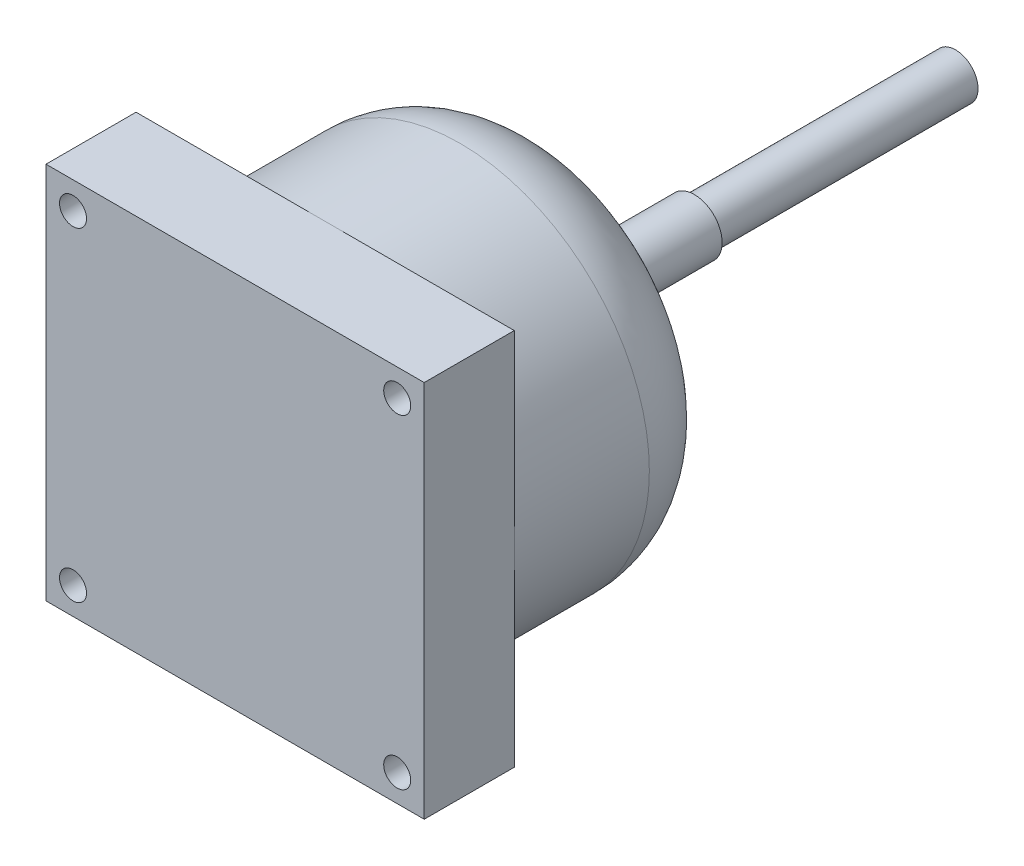
ISO-10303-21;
HEADER;
FILE_DESCRIPTION(('STEP AP214'),'2;1');
FILE_NAME('part.step','',(''),(''),'','','');
FILE_SCHEMA(('AUTOMOTIVE_DESIGN { 1 0 10303 214 1 1 1 1 }'));
ENDSEC;
DATA;
#1=APPLICATION_CONTEXT('core data for automotive mechanical design processes');
#2=APPLICATION_PROTOCOL_DEFINITION('international standard','automotive_design',2000,#1);
#3=PRODUCT_CONTEXT('',#1,'mechanical');
#4=PRODUCT('Part','Part','',(#3));
#5=PRODUCT_RELATED_PRODUCT_CATEGORY('part','',(#4));
#6=PRODUCT_DEFINITION_FORMATION('','',#4);
#7=PRODUCT_DEFINITION_CONTEXT('part definition',#1,'design');
#8=PRODUCT_DEFINITION('design','',#6,#7);
#9=PRODUCT_DEFINITION_SHAPE('','',#8);
#10=(LENGTH_UNIT() NAMED_UNIT(*) SI_UNIT(.MILLI.,.METRE.));
#11=(NAMED_UNIT(*) PLANE_ANGLE_UNIT() SI_UNIT($,.RADIAN.));
#12=(NAMED_UNIT(*) SI_UNIT($,.STERADIAN.) SOLID_ANGLE_UNIT());
#13=UNCERTAINTY_MEASURE_WITH_UNIT(LENGTH_MEASURE(1.E-05),#10,'distance_accuracy_value','');
#14=(GEOMETRIC_REPRESENTATION_CONTEXT(3) GLOBAL_UNCERTAINTY_ASSIGNED_CONTEXT((#13)) GLOBAL_UNIT_ASSIGNED_CONTEXT((#10,
#11,#12)) REPRESENTATION_CONTEXT('',''));
#15=CARTESIAN_POINT('',(0.,0.,0.));
#16=DIRECTION('',(0.,0.,1.));
#17=DIRECTION('',(1.,0.,0.));
#18=AXIS2_PLACEMENT_3D('',#15,#16,#17);
#19=CARTESIAN_POINT('',(-33.2954156821291,25.452495543672,46.));
#20=DIRECTION('',(0.,0.,-1.));
#21=DIRECTION('',(-1.,0.,0.));
#22=AXIS2_PLACEMENT_3D('',#19,#20,#21);
#23=CYLINDRICAL_SURFACE('',#22,21.);
#24=CARTESIAN_POINT('',(-33.2954156821291,25.452495543672,10.));
#25=DIRECTION('',(0.,0.,1.));
#26=DIRECTION('',(1.,0.,0.));
#27=AXIS2_PLACEMENT_3D('',#24,#25,#26);
#28=CIRCLE('',#27,21.);
#29=CARTESIAN_POINT('',(-12.2954156821291,25.452495543672,10.));
#30=VERTEX_POINT('',#29);
#31=EDGE_CURVE('E134',#30,#30,#28,.T.);
#32=ORIENTED_EDGE('',*,*,#31,.T.);
#33=EDGE_LOOP('',(#32));
#34=FACE_BOUND('',#33,.T.);
#35=CARTESIAN_POINT('',(-33.2954156821291,25.452495543672,25.));
#36=DIRECTION('',(0.,0.,-1.));
#37=DIRECTION('',(-1.,0.,0.));
#38=AXIS2_PLACEMENT_3D('',#35,#36,#37);
#39=CIRCLE('',#38,21.);
#40=CARTESIAN_POINT('',(-54.2954156821291,25.452495543672,25.));
#41=VERTEX_POINT('',#40);
#42=CARTESIAN_POINT('',(-33.2954156821291,46.452495543672,25.));
#43=VERTEX_POINT('',#42);
#44=EDGE_CURVE('E124',#41,#43,#39,.T.);
#45=ORIENTED_EDGE('',*,*,#44,.T.);
#46=CARTESIAN_POINT('',(-33.2954156821291,25.452495543672,25.));
#47=DIRECTION('',(0.,0.,-1.));
#48=DIRECTION('',(-1.,0.,0.));
#49=AXIS2_PLACEMENT_3D('',#46,#47,#48);
#50=CIRCLE('',#49,21.);
#51=CARTESIAN_POINT('',(-12.2954156821291,25.452495543672,25.));
#52=VERTEX_POINT('',#51);
#53=EDGE_CURVE('E111',#43,#52,#50,.T.);
#54=ORIENTED_EDGE('',*,*,#53,.T.);
#55=CARTESIAN_POINT('',(-33.2954156821291,25.452495543672,25.));
#56=DIRECTION('',(0.,0.,-1.));
#57=DIRECTION('',(-1.,0.,0.));
#58=AXIS2_PLACEMENT_3D('',#55,#56,#57);
#59=CIRCLE('',#58,21.);
#60=CARTESIAN_POINT('',(-33.2954156821291,4.45249554367201,25.));
#61=VERTEX_POINT('',#60);
#62=EDGE_CURVE('E300',#52,#61,#59,.T.);
#63=ORIENTED_EDGE('',*,*,#62,.T.);
#64=CARTESIAN_POINT('',(-33.2954156821291,25.452495543672,25.));
#65=DIRECTION('',(0.,0.,-1.));
#66=DIRECTION('',(-1.,0.,0.));
#67=AXIS2_PLACEMENT_3D('',#64,#65,#66);
#68=CIRCLE('',#67,21.);
#69=EDGE_CURVE('E132',#61,#41,#68,.T.);
#70=ORIENTED_EDGE('',*,*,#69,.T.);
#71=EDGE_LOOP('',(#45,#54,#63,#70));
#72=FACE_BOUND('',#71,.T.);
#73=ADVANCED_FACE('F47',(#34,#72),#23,.T.);
#74=CARTESIAN_POINT('',(-33.2954156821291,25.452495543672,0.));
#75=DIRECTION('',(0.,0.,1.));
#76=DIRECTION('',(1.,0.,0.));
#77=AXIS2_PLACEMENT_3D('',#74,#75,#76);
#78=PLANE('',#77);
#79=CARTESIAN_POINT('',(-33.2954156821291,25.452495543672,0.));
#80=DIRECTION('',(0.,0.,1.));
#81=DIRECTION('',(1.,0.,0.));
#82=AXIS2_PLACEMENT_3D('',#79,#80,#81);
#83=CIRCLE('',#82,3.07937286828549);
#84=CARTESIAN_POINT('',(-30.2160428138436,25.452495543672,0.));
#85=VERTEX_POINT('',#84);
#86=EDGE_CURVE('E145',#85,#85,#83,.F.);
#87=ORIENTED_EDGE('',*,*,#86,.F.);
#88=EDGE_LOOP('',(#87));
#89=FACE_BOUND('',#88,.T.);
#90=CARTESIAN_POINT('',(-33.2954156821291,25.452495543672,0.));
#91=DIRECTION('',(0.,0.,1.));
#92=DIRECTION('',(1.,0.,0.));
#93=AXIS2_PLACEMENT_3D('',#90,#91,#92);
#94=CIRCLE('',#93,11.);
#95=CARTESIAN_POINT('',(-22.2954156821291,25.452495543672,0.));
#96=VERTEX_POINT('',#95);
#97=EDGE_CURVE('E140',#96,#96,#94,.F.);
#98=ORIENTED_EDGE('',*,*,#97,.T.);
#99=EDGE_LOOP('',(#98));
#100=FACE_BOUND('',#99,.T.);
#101=ADVANCED_FACE('F174',(#89,#100),#78,.F.);
#102=CARTESIAN_POINT('',(-33.2954156821291,25.452495543672,10.));
#103=DIRECTION('',(0.,0.,1.));
#104=DIRECTION('',(1.,0.,0.));
#105=AXIS2_PLACEMENT_3D('',#102,#103,#104);
#106=TOROIDAL_SURFACE('',#105,11.,10.);
#107=ORIENTED_EDGE('',*,*,#97,.F.);
#108=EDGE_LOOP('',(#107));
#109=FACE_BOUND('',#108,.T.);
#110=ORIENTED_EDGE('',*,*,#31,.F.);
#111=EDGE_LOOP('',(#110));
#112=FACE_BOUND('',#111,.T.);
#113=ADVANCED_FACE('F170',(#109,#112),#106,.T.);
#114=CARTESIAN_POINT('',(-33.2954156821291,25.452495543672,-16.));
#115=DIRECTION('',(0.,0.,1.));
#116=DIRECTION('',(1.,0.,0.));
#117=AXIS2_PLACEMENT_3D('',#114,#115,#116);
#118=CYLINDRICAL_SURFACE('',#117,3.07937286828549);
#119=CARTESIAN_POINT('',(-33.2954156821291,25.452495543672,-16.));
#120=DIRECTION('',(0.,0.,-1.));
#121=DIRECTION('',(-1.,0.,0.));
#122=AXIS2_PLACEMENT_3D('',#119,#120,#121);
#123=CIRCLE('',#122,3.07937286828549);
#124=CARTESIAN_POINT('',(-36.3747885504146,25.452495543672,-16.));
#125=VERTEX_POINT('',#124);
#126=EDGE_CURVE('E149',#125,#125,#123,.T.);
#127=ORIENTED_EDGE('',*,*,#126,.F.);
#128=EDGE_LOOP('',(#127));
#129=FACE_BOUND('',#128,.T.);
#130=ORIENTED_EDGE('',*,*,#86,.T.);
#131=EDGE_LOOP('',(#130));
#132=FACE_BOUND('',#131,.T.);
#133=ADVANCED_FACE('F164',(#129,#132),#118,.T.);
#134=CARTESIAN_POINT('',(-33.2954156821291,25.452495543672,-16.));
#135=DIRECTION('',(0.,0.,-1.));
#136=DIRECTION('',(-1.,0.,0.));
#137=AXIS2_PLACEMENT_3D('',#134,#135,#136);
#138=PLANE('',#137);
#139=CARTESIAN_POINT('',(-33.2954156821291,25.452495543672,-16.));
#140=DIRECTION('',(0.,0.,-1.));
#141=DIRECTION('',(-1.,0.,0.));
#142=AXIS2_PLACEMENT_3D('',#139,#140,#141);
#143=CIRCLE('',#142,2.5);
#144=CARTESIAN_POINT('',(-35.7954156821291,25.452495543672,-16.));
#145=VERTEX_POINT('',#144);
#146=EDGE_CURVE('E57',#145,#145,#143,.T.);
#147=ORIENTED_EDGE('',*,*,#146,.F.);
#148=EDGE_LOOP('',(#147));
#149=FACE_BOUND('',#148,.T.);
#150=ORIENTED_EDGE('',*,*,#126,.T.);
#151=EDGE_LOOP('',(#150));
#152=FACE_BOUND('',#151,.T.);
#153=ADVANCED_FACE('F161',(#149,#152),#138,.T.);
#154=CARTESIAN_POINT('',(-33.2954156821291,25.452495543672,-45.));
#155=DIRECTION('',(0.,0.,1.));
#156=DIRECTION('',(1.,0.,0.));
#157=AXIS2_PLACEMENT_3D('',#154,#155,#156);
#158=CYLINDRICAL_SURFACE('',#157,2.5);
#159=CARTESIAN_POINT('',(-33.2954156821291,25.452495543672,-45.));
#160=DIRECTION('',(0.,0.,-1.));
#161=DIRECTION('',(-1.,0.,0.));
#162=AXIS2_PLACEMENT_3D('',#159,#160,#161);
#163=CIRCLE('',#162,2.5);
#164=CARTESIAN_POINT('',(-35.7954156821291,25.452495543672,-45.));
#165=VERTEX_POINT('',#164);
#166=EDGE_CURVE('E11',#165,#165,#163,.T.);
#167=ORIENTED_EDGE('',*,*,#166,.F.);
#168=EDGE_LOOP('',(#167));
#169=FACE_BOUND('',#168,.T.);
#170=ORIENTED_EDGE('',*,*,#146,.T.);
#171=EDGE_LOOP('',(#170));
#172=FACE_BOUND('',#171,.T.);
#173=ADVANCED_FACE('F159',(#169,#172),#158,.T.);
#174=CARTESIAN_POINT('',(-33.2954156821291,25.452495543672,-45.));
#175=DIRECTION('',(0.,0.,-1.));
#176=DIRECTION('',(-1.,0.,0.));
#177=AXIS2_PLACEMENT_3D('',#174,#175,#176);
#178=PLANE('',#177);
#179=ORIENTED_EDGE('',*,*,#166,.T.);
#180=EDGE_LOOP('',(#179));
#181=FACE_BOUND('',#180,.T.);
#182=ADVANCED_FACE('F49',(#181),#178,.T.);
#183=CARTESIAN_POINT('',(-33.2954156821291,25.452495543672,35.));
#184=DIRECTION('',(0.,0.,1.));
#185=DIRECTION('',(1.,0.,0.));
#186=AXIS2_PLACEMENT_3D('',#183,#184,#185);
#187=PLANE('',#186);
#188=CARTESIAN_POINT('',(-15.2954156821291,7.45249554367201,35.));
#189=DIRECTION('',(0.,0.,-1.));
#190=DIRECTION('',(-1.,0.,0.));
#191=AXIS2_PLACEMENT_3D('',#188,#189,#190);
#192=CIRCLE('',#191,1.5);
#193=CARTESIAN_POINT('',(-16.7954156821291,7.45249554367201,35.));
#194=VERTEX_POINT('',#193);
#195=EDGE_CURVE('E280',#194,#194,#192,.T.);
#196=ORIENTED_EDGE('',*,*,#195,.T.);
#197=EDGE_LOOP('',(#196));
#198=FACE_BOUND('',#197,.T.);
#199=CARTESIAN_POINT('',(-51.2954156821291,7.45249554367201,35.));
#200=DIRECTION('',(0.,0.,-1.));
#201=DIRECTION('',(-1.,0.,0.));
#202=AXIS2_PLACEMENT_3D('',#199,#200,#201);
#203=CIRCLE('',#202,1.5);
#204=CARTESIAN_POINT('',(-52.7954156821291,7.45249554367201,35.));
#205=VERTEX_POINT('',#204);
#206=EDGE_CURVE('E272',#205,#205,#203,.T.);
#207=ORIENTED_EDGE('',*,*,#206,.T.);
#208=EDGE_LOOP('',(#207));
#209=FACE_BOUND('',#208,.T.);
#210=CARTESIAN_POINT('',(-51.2954156821291,43.452495543672,35.));
#211=DIRECTION('',(0.,0.,-1.));
#212=DIRECTION('',(-1.,0.,0.));
#213=AXIS2_PLACEMENT_3D('',#210,#211,#212);
#214=CIRCLE('',#213,1.5);
#215=CARTESIAN_POINT('',(-52.7954156821291,43.452495543672,35.));
#216=VERTEX_POINT('',#215);
#217=EDGE_CURVE('E255',#216,#216,#214,.T.);
#218=ORIENTED_EDGE('',*,*,#217,.T.);
#219=EDGE_LOOP('',(#218));
#220=FACE_BOUND('',#219,.T.);
#221=CARTESIAN_POINT('',(-15.2954156821291,43.452495543672,35.));
#222=DIRECTION('',(0.,0.,-1.));
#223=DIRECTION('',(-1.,0.,0.));
#224=AXIS2_PLACEMENT_3D('',#221,#222,#223);
#225=CIRCLE('',#224,1.5);
#226=CARTESIAN_POINT('',(-16.7954156821291,43.452495543672,35.));
#227=VERTEX_POINT('',#226);
#228=EDGE_CURVE('E108',#227,#227,#225,.T.);
#229=ORIENTED_EDGE('',*,*,#228,.T.);
#230=EDGE_LOOP('',(#229));
#231=FACE_BOUND('',#230,.T.);
#232=DIRECTION('',(0.,-1.,0.));
#233=VECTOR('',#232,1.);
#234=CARTESIAN_POINT('',(-54.2954156821291,4.45249554367201,35.));
#235=LINE('',#234,#233);
#236=CARTESIAN_POINT('',(-54.2954156821291,46.452495543672,35.));
#237=VERTEX_POINT('',#236);
#238=CARTESIAN_POINT('',(-54.2954156821291,4.45249554367201,35.));
#239=VERTEX_POINT('',#238);
#240=EDGE_CURVE('E142',#237,#239,#235,.T.);
#241=ORIENTED_EDGE('',*,*,#240,.T.);
#242=DIRECTION('',(1.,0.,0.));
#243=VECTOR('',#242,1.);
#244=CARTESIAN_POINT('',(-12.2954156821291,4.45249554367201,35.));
#245=LINE('',#244,#243);
#246=CARTESIAN_POINT('',(-12.2954156821291,4.45249554367201,35.));
#247=VERTEX_POINT('',#246);
#248=EDGE_CURVE('E303',#239,#247,#245,.T.);
#249=ORIENTED_EDGE('',*,*,#248,.T.);
#250=DIRECTION('',(0.,1.,0.));
#251=VECTOR('',#250,1.);
#252=CARTESIAN_POINT('',(-12.2954156821291,46.452495543672,35.));
#253=LINE('',#252,#251);
#254=CARTESIAN_POINT('',(-12.2954156821291,46.452495543672,35.));
#255=VERTEX_POINT('',#254);
#256=EDGE_CURVE('E119',#247,#255,#253,.T.);
#257=ORIENTED_EDGE('',*,*,#256,.T.);
#258=DIRECTION('',(-1.,0.,0.));
#259=VECTOR('',#258,1.);
#260=CARTESIAN_POINT('',(-54.2954156821291,46.452495543672,35.));
#261=LINE('',#260,#259);
#262=EDGE_CURVE('E63',#255,#237,#261,.T.);
#263=ORIENTED_EDGE('',*,*,#262,.T.);
#264=EDGE_LOOP('',(#241,#249,#257,#263));
#265=FACE_BOUND('',#264,.T.);
#266=ADVANCED_FACE('F196',(#198,#209,#220,#231,#265),#187,.T.);
#267=CARTESIAN_POINT('',(0.,0.,25.));
#268=DIRECTION('',(0.,0.,-1.));
#269=DIRECTION('',(-1.,0.,0.));
#270=AXIS2_PLACEMENT_3D('',#267,#268,#269);
#271=PLANE('',#270);
#272=CARTESIAN_POINT('',(-51.2954156821291,43.452495543672,25.));
#273=DIRECTION('',(0.,0.,-1.));
#274=DIRECTION('',(-1.,0.,0.));
#275=AXIS2_PLACEMENT_3D('',#272,#273,#274);
#276=CIRCLE('',#275,1.5);
#277=CARTESIAN_POINT('',(-52.7954156821291,43.452495543672,25.));
#278=VERTEX_POINT('',#277);
#279=EDGE_CURVE('E258',#278,#278,#276,.T.);
#280=ORIENTED_EDGE('',*,*,#279,.F.);
#281=EDGE_LOOP('',(#280));
#282=FACE_BOUND('',#281,.T.);
#283=ORIENTED_EDGE('',*,*,#44,.F.);
#284=DIRECTION('',(0.,-1.,0.));
#285=VECTOR('',#284,1.);
#286=CARTESIAN_POINT('',(-54.2954156821291,4.45249554367201,25.));
#287=LINE('',#286,#285);
#288=CARTESIAN_POINT('',(-54.2954156821291,46.452495543672,25.));
#289=VERTEX_POINT('',#288);
#290=EDGE_CURVE('E126',#289,#41,#287,.T.);
#291=ORIENTED_EDGE('',*,*,#290,.F.);
#292=DIRECTION('',(-1.,0.,0.));
#293=VECTOR('',#292,1.);
#294=CARTESIAN_POINT('',(-33.2954156821291,46.452495543672,25.));
#295=LINE('',#294,#293);
#296=EDGE_CURVE('E102',#43,#289,#295,.T.);
#297=ORIENTED_EDGE('',*,*,#296,.F.);
#298=EDGE_LOOP('',(#283,#291,#297));
#299=FACE_BOUND('',#298,.T.);
#300=ADVANCED_FACE('F123',(#282,#299),#271,.T.);
#301=CARTESIAN_POINT('',(-33.2954156821291,46.452495543672,35.));
#302=DIRECTION('',(0.,-1.,0.));
#303=DIRECTION('',(0.,0.,-1.));
#304=AXIS2_PLACEMENT_3D('',#301,#302,#303);
#305=PLANE('',#304);
#306=ORIENTED_EDGE('',*,*,#262,.F.);
#307=DIRECTION('',(0.,0.,-1.));
#308=VECTOR('',#307,1.);
#309=CARTESIAN_POINT('',(-12.2954156821291,46.452495543672,35.));
#310=LINE('',#309,#308);
#311=CARTESIAN_POINT('',(-12.2954156821291,46.452495543672,25.));
#312=VERTEX_POINT('',#311);
#313=EDGE_CURVE('E105',#255,#312,#310,.T.);
#314=ORIENTED_EDGE('',*,*,#313,.T.);
#315=DIRECTION('',(-1.,0.,0.));
#316=VECTOR('',#315,1.);
#317=CARTESIAN_POINT('',(-33.2954156821291,46.452495543672,25.));
#318=LINE('',#317,#316);
#319=EDGE_CURVE('E97',#312,#43,#318,.T.);
#320=ORIENTED_EDGE('',*,*,#319,.T.);
#321=ORIENTED_EDGE('',*,*,#296,.T.);
#322=DIRECTION('',(0.,0.,-1.));
#323=VECTOR('',#322,1.);
#324=CARTESIAN_POINT('',(-54.2954156821291,46.452495543672,35.));
#325=LINE('',#324,#323);
#326=EDGE_CURVE('E135',#237,#289,#325,.T.);
#327=ORIENTED_EDGE('',*,*,#326,.F.);
#328=EDGE_LOOP('',(#306,#314,#320,#321,#327));
#329=FACE_BOUND('',#328,.T.);
#330=ADVANCED_FACE('F99',(#329),#305,.F.);
#331=CARTESIAN_POINT('',(-54.2954156821291,4.45249554367201,35.));
#332=DIRECTION('',(1.,0.,0.));
#333=DIRECTION('',(0.,0.,-1.));
#334=AXIS2_PLACEMENT_3D('',#331,#332,#333);
#335=PLANE('',#334);
#336=ORIENTED_EDGE('',*,*,#290,.T.);
#337=DIRECTION('',(0.,-1.,0.));
#338=VECTOR('',#337,1.);
#339=CARTESIAN_POINT('',(-54.2954156821291,4.45249554367201,25.));
#340=LINE('',#339,#338);
#341=CARTESIAN_POINT('',(-54.2954156821291,4.45249554367201,25.));
#342=VERTEX_POINT('',#341);
#343=EDGE_CURVE('E310',#41,#342,#340,.T.);
#344=ORIENTED_EDGE('',*,*,#343,.T.);
#345=DIRECTION('',(0.,0.,-1.));
#346=VECTOR('',#345,1.);
#347=CARTESIAN_POINT('',(-54.2954156821291,4.45249554367201,35.));
#348=LINE('',#347,#346);
#349=EDGE_CURVE('E306',#239,#342,#348,.T.);
#350=ORIENTED_EDGE('',*,*,#349,.F.);
#351=ORIENTED_EDGE('',*,*,#240,.F.);
#352=ORIENTED_EDGE('',*,*,#326,.T.);
#353=EDGE_LOOP('',(#336,#344,#350,#351,#352));
#354=FACE_BOUND('',#353,.T.);
#355=ADVANCED_FACE('F212',(#354),#335,.F.);
#356=CARTESIAN_POINT('',(0.,0.,25.));
#357=DIRECTION('',(0.,0.,-1.));
#358=DIRECTION('',(-1.,0.,0.));
#359=AXIS2_PLACEMENT_3D('',#356,#357,#358);
#360=PLANE('',#359);
#361=CARTESIAN_POINT('',(-51.2954156821291,7.45249554367201,25.));
#362=DIRECTION('',(0.,0.,-1.));
#363=DIRECTION('',(-1.,0.,0.));
#364=AXIS2_PLACEMENT_3D('',#361,#362,#363);
#365=CIRCLE('',#364,1.5);
#366=CARTESIAN_POINT('',(-52.7954156821291,7.45249554367201,25.));
#367=VERTEX_POINT('',#366);
#368=EDGE_CURVE('E266',#367,#367,#365,.T.);
#369=ORIENTED_EDGE('',*,*,#368,.F.);
#370=EDGE_LOOP('',(#369));
#371=FACE_BOUND('',#370,.T.);
#372=ORIENTED_EDGE('',*,*,#69,.F.);
#373=DIRECTION('',(1.,0.,0.));
#374=VECTOR('',#373,1.);
#375=CARTESIAN_POINT('',(-12.2954156821291,4.45249554367201,25.));
#376=LINE('',#375,#374);
#377=EDGE_CURVE('E311',#342,#61,#376,.T.);
#378=ORIENTED_EDGE('',*,*,#377,.F.);
#379=ORIENTED_EDGE('',*,*,#343,.F.);
#380=EDGE_LOOP('',(#372,#378,#379));
#381=FACE_BOUND('',#380,.T.);
#382=ADVANCED_FACE('F215',(#371,#381),#360,.T.);
#383=CARTESIAN_POINT('',(-12.2954156821291,4.45249554367201,35.));
#384=DIRECTION('',(0.,1.,0.));
#385=DIRECTION('',(0.,0.,1.));
#386=AXIS2_PLACEMENT_3D('',#383,#384,#385);
#387=PLANE('',#386);
#388=ORIENTED_EDGE('',*,*,#377,.T.);
#389=DIRECTION('',(1.,0.,0.));
#390=VECTOR('',#389,1.);
#391=CARTESIAN_POINT('',(-12.2954156821291,4.45249554367201,25.));
#392=LINE('',#391,#390);
#393=CARTESIAN_POINT('',(-12.2954156821291,4.45249554367201,25.));
#394=VERTEX_POINT('',#393);
#395=EDGE_CURVE('E294',#61,#394,#392,.T.);
#396=ORIENTED_EDGE('',*,*,#395,.T.);
#397=DIRECTION('',(0.,0.,-1.));
#398=VECTOR('',#397,1.);
#399=CARTESIAN_POINT('',(-12.2954156821291,4.45249554367201,35.));
#400=LINE('',#399,#398);
#401=EDGE_CURVE('E290',#247,#394,#400,.T.);
#402=ORIENTED_EDGE('',*,*,#401,.F.);
#403=ORIENTED_EDGE('',*,*,#248,.F.);
#404=ORIENTED_EDGE('',*,*,#349,.T.);
#405=EDGE_LOOP('',(#388,#396,#402,#403,#404));
#406=FACE_BOUND('',#405,.T.);
#407=ADVANCED_FACE('F218',(#406),#387,.F.);
#408=CARTESIAN_POINT('',(0.,0.,25.));
#409=DIRECTION('',(0.,0.,-1.));
#410=DIRECTION('',(-1.,0.,0.));
#411=AXIS2_PLACEMENT_3D('',#408,#409,#410);
#412=PLANE('',#411);
#413=CARTESIAN_POINT('',(-15.2954156821291,7.45249554367201,25.));
#414=DIRECTION('',(0.,0.,-1.));
#415=DIRECTION('',(-1.,0.,0.));
#416=AXIS2_PLACEMENT_3D('',#413,#414,#415);
#417=CIRCLE('',#416,1.5);
#418=CARTESIAN_POINT('',(-16.7954156821291,7.45249554367201,25.));
#419=VERTEX_POINT('',#418);
#420=EDGE_CURVE('E276',#419,#419,#417,.T.);
#421=ORIENTED_EDGE('',*,*,#420,.F.);
#422=EDGE_LOOP('',(#421));
#423=FACE_BOUND('',#422,.T.);
#424=ORIENTED_EDGE('',*,*,#62,.F.);
#425=DIRECTION('',(0.,1.,0.));
#426=VECTOR('',#425,1.);
#427=CARTESIAN_POINT('',(-12.2954156821291,46.452495543672,25.));
#428=LINE('',#427,#426);
#429=EDGE_CURVE('E295',#394,#52,#428,.T.);
#430=ORIENTED_EDGE('',*,*,#429,.F.);
#431=ORIENTED_EDGE('',*,*,#395,.F.);
#432=EDGE_LOOP('',(#424,#430,#431));
#433=FACE_BOUND('',#432,.T.);
#434=ADVANCED_FACE('F221',(#423,#433),#412,.T.);
#435=CARTESIAN_POINT('',(-12.2954156821291,46.452495543672,35.));
#436=DIRECTION('',(-1.,0.,0.));
#437=DIRECTION('',(0.,0.,1.));
#438=AXIS2_PLACEMENT_3D('',#435,#436,#437);
#439=PLANE('',#438);
#440=ORIENTED_EDGE('',*,*,#429,.T.);
#441=DIRECTION('',(0.,1.,0.));
#442=VECTOR('',#441,1.);
#443=CARTESIAN_POINT('',(-12.2954156821291,46.452495543672,25.));
#444=LINE('',#443,#442);
#445=EDGE_CURVE('E113',#52,#312,#444,.T.);
#446=ORIENTED_EDGE('',*,*,#445,.T.);
#447=ORIENTED_EDGE('',*,*,#313,.F.);
#448=ORIENTED_EDGE('',*,*,#256,.F.);
#449=ORIENTED_EDGE('',*,*,#401,.T.);
#450=EDGE_LOOP('',(#440,#446,#447,#448,#449));
#451=FACE_BOUND('',#450,.T.);
#452=ADVANCED_FACE('F228',(#451),#439,.F.);
#453=CARTESIAN_POINT('',(0.,0.,25.));
#454=DIRECTION('',(0.,0.,-1.));
#455=DIRECTION('',(-1.,0.,0.));
#456=AXIS2_PLACEMENT_3D('',#453,#454,#455);
#457=PLANE('',#456);
#458=CARTESIAN_POINT('',(-15.2954156821291,43.452495543672,25.));
#459=DIRECTION('',(0.,0.,-1.));
#460=DIRECTION('',(-1.,0.,0.));
#461=AXIS2_PLACEMENT_3D('',#458,#459,#460);
#462=CIRCLE('',#461,1.5);
#463=CARTESIAN_POINT('',(-16.7954156821291,43.452495543672,25.));
#464=VERTEX_POINT('',#463);
#465=EDGE_CURVE('E260',#464,#464,#462,.T.);
#466=ORIENTED_EDGE('',*,*,#465,.F.);
#467=EDGE_LOOP('',(#466));
#468=FACE_BOUND('',#467,.T.);
#469=ORIENTED_EDGE('',*,*,#53,.F.);
#470=ORIENTED_EDGE('',*,*,#319,.F.);
#471=ORIENTED_EDGE('',*,*,#445,.F.);
#472=EDGE_LOOP('',(#469,#470,#471));
#473=FACE_BOUND('',#472,.T.);
#474=ADVANCED_FACE('F112',(#468,#473),#457,.T.);
#475=CARTESIAN_POINT('',(-15.2954156821291,43.452495543672,35.));
#476=DIRECTION('',(0.,0.,-1.));
#477=DIRECTION('',(-1.,0.,0.));
#478=AXIS2_PLACEMENT_3D('',#475,#476,#477);
#479=CYLINDRICAL_SURFACE('',#478,1.5);
#480=ORIENTED_EDGE('',*,*,#228,.F.);
#481=EDGE_LOOP('',(#480));
#482=FACE_BOUND('',#481,.T.);
#483=ORIENTED_EDGE('',*,*,#465,.T.);
#484=EDGE_LOOP('',(#483));
#485=FACE_BOUND('',#484,.T.);
#486=ADVANCED_FACE('F234',(#482,#485),#479,.F.);
#487=CARTESIAN_POINT('',(-15.2954156821291,7.45249554367201,35.));
#488=DIRECTION('',(0.,0.,-1.));
#489=DIRECTION('',(-1.,0.,0.));
#490=AXIS2_PLACEMENT_3D('',#487,#488,#489);
#491=CYLINDRICAL_SURFACE('',#490,1.5);
#492=ORIENTED_EDGE('',*,*,#195,.F.);
#493=EDGE_LOOP('',(#492));
#494=FACE_BOUND('',#493,.T.);
#495=ORIENTED_EDGE('',*,*,#420,.T.);
#496=EDGE_LOOP('',(#495));
#497=FACE_BOUND('',#496,.T.);
#498=ADVANCED_FACE('F238',(#494,#497),#491,.F.);
#499=CARTESIAN_POINT('',(-51.2954156821291,7.45249554367201,35.));
#500=DIRECTION('',(0.,0.,-1.));
#501=DIRECTION('',(-1.,0.,0.));
#502=AXIS2_PLACEMENT_3D('',#499,#500,#501);
#503=CYLINDRICAL_SURFACE('',#502,1.5);
#504=ORIENTED_EDGE('',*,*,#206,.F.);
#505=EDGE_LOOP('',(#504));
#506=FACE_BOUND('',#505,.T.);
#507=ORIENTED_EDGE('',*,*,#368,.T.);
#508=EDGE_LOOP('',(#507));
#509=FACE_BOUND('',#508,.T.);
#510=ADVANCED_FACE('F242',(#506,#509),#503,.F.);
#511=CARTESIAN_POINT('',(-51.2954156821291,43.452495543672,35.));
#512=DIRECTION('',(0.,0.,-1.));
#513=DIRECTION('',(-1.,0.,0.));
#514=AXIS2_PLACEMENT_3D('',#511,#512,#513);
#515=CYLINDRICAL_SURFACE('',#514,1.5);
#516=ORIENTED_EDGE('',*,*,#217,.F.);
#517=EDGE_LOOP('',(#516));
#518=FACE_BOUND('',#517,.T.);
#519=ORIENTED_EDGE('',*,*,#279,.T.);
#520=EDGE_LOOP('',(#519));
#521=FACE_BOUND('',#520,.T.);
#522=ADVANCED_FACE('F246',(#518,#521),#515,.F.);
#523=CLOSED_SHELL('',(#73,#101,#113,#133,#153,#173,#182,#266,#300,#330,#355,#382,#407,#434,#452,
#474,#486,#498,#510,#522));
#524=MANIFOLD_SOLID_BREP('B2',#523);
#525=ADVANCED_BREP_SHAPE_REPRESENTATION('',(#18,#524),#14);
#526=SHAPE_DEFINITION_REPRESENTATION(#9,#525);
ENDSEC;
END-ISO-10303-21;
